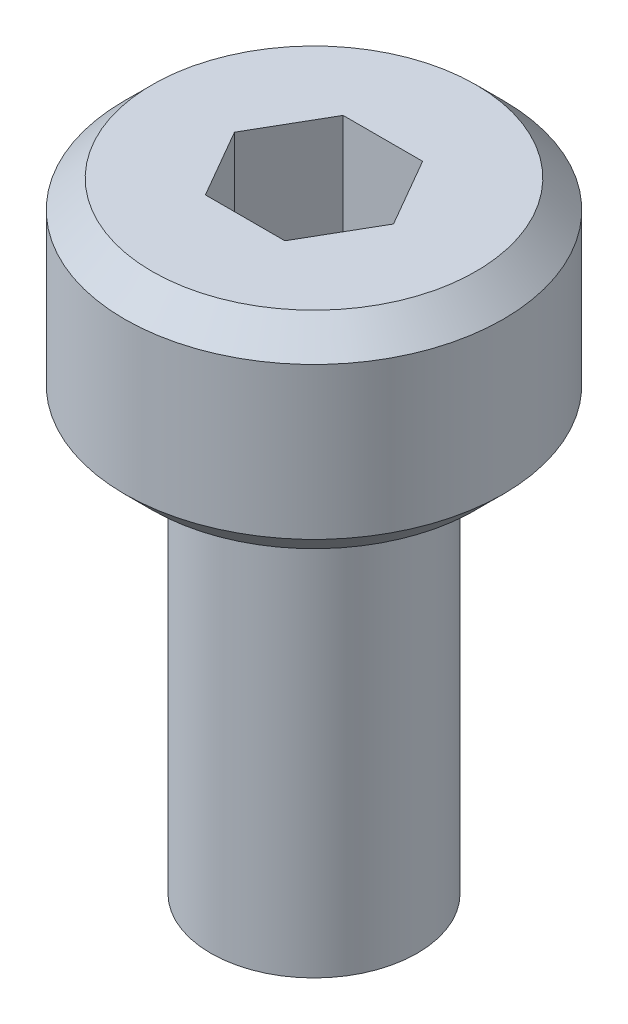
ISO-10303-21;
HEADER;
FILE_DESCRIPTION(('STEP AP214'),'2;1');
FILE_NAME('part.step','',(''),(''),'','','');
FILE_SCHEMA(('AUTOMOTIVE_DESIGN { 1 0 10303 214 1 1 1 1 }'));
ENDSEC;
DATA;
#1=APPLICATION_CONTEXT('core data for automotive mechanical design processes');
#2=APPLICATION_PROTOCOL_DEFINITION('international standard','automotive_design',2000,#1);
#3=PRODUCT_CONTEXT('',#1,'mechanical');
#4=PRODUCT('Part','Part','',(#3));
#5=PRODUCT_RELATED_PRODUCT_CATEGORY('part','',(#4));
#6=PRODUCT_DEFINITION_FORMATION('','',#4);
#7=PRODUCT_DEFINITION_CONTEXT('part definition',#1,'design');
#8=PRODUCT_DEFINITION('design','',#6,#7);
#9=PRODUCT_DEFINITION_SHAPE('','',#8);
#10=(LENGTH_UNIT() NAMED_UNIT(*) SI_UNIT(.MILLI.,.METRE.));
#11=(NAMED_UNIT(*) PLANE_ANGLE_UNIT() SI_UNIT($,.RADIAN.));
#12=(NAMED_UNIT(*) SI_UNIT($,.STERADIAN.) SOLID_ANGLE_UNIT());
#13=UNCERTAINTY_MEASURE_WITH_UNIT(LENGTH_MEASURE(1.E-05),#10,'distance_accuracy_value','');
#14=(GEOMETRIC_REPRESENTATION_CONTEXT(3) GLOBAL_UNCERTAINTY_ASSIGNED_CONTEXT((#13)) GLOBAL_UNIT_ASSIGNED_CONTEXT((#10,
#11,#12)) REPRESENTATION_CONTEXT('',''));
#15=CARTESIAN_POINT('',(0.,0.,0.));
#16=DIRECTION('',(0.,0.,1.));
#17=DIRECTION('',(1.,0.,0.));
#18=AXIS2_PLACEMENT_3D('',#15,#16,#17);
#19=CARTESIAN_POINT('',(0.,9.,0.));
#20=DIRECTION('',(0.,1.,0.));
#21=DIRECTION('',(0.,0.,1.));
#22=AXIS2_PLACEMENT_3D('',#19,#20,#21);
#23=PLANE('',#22);
#24=DIRECTION('',(1.,0.,0.));
#25=VECTOR('',#24,1.);
#26=CARTESIAN_POINT('',(-0.577350269189628,9.,1.));
#27=LINE('',#26,#25);
#28=CARTESIAN_POINT('',(-0.577350269189628,9.,1.));
#29=VERTEX_POINT('',#28);
#30=CARTESIAN_POINT('',(0.577350269189625,9.,1.));
#31=VERTEX_POINT('',#30);
#32=EDGE_CURVE('E58',#29,#31,#27,.T.);
#33=ORIENTED_EDGE('',*,*,#32,.F.);
#34=DIRECTION('',(0.499999999999999,0.,0.866025403784439));
#35=VECTOR('',#34,1.);
#36=CARTESIAN_POINT('',(-1.15470053837925,9.,0.));
#37=LINE('',#36,#35);
#38=CARTESIAN_POINT('',(-1.15470053837925,9.,0.));
#39=VERTEX_POINT('',#38);
#40=EDGE_CURVE('E151',#39,#29,#37,.T.);
#41=ORIENTED_EDGE('',*,*,#40,.F.);
#42=DIRECTION('',(-0.5,0.,0.866025403784439));
#43=VECTOR('',#42,1.);
#44=CARTESIAN_POINT('',(-0.577350269189626,9.,-1.));
#45=LINE('',#44,#43);
#46=CARTESIAN_POINT('',(-0.577350269189626,9.,-1.));
#47=VERTEX_POINT('',#46);
#48=EDGE_CURVE('E148',#47,#39,#45,.T.);
#49=ORIENTED_EDGE('',*,*,#48,.F.);
#50=DIRECTION('',(-1.,0.,0.));
#51=VECTOR('',#50,1.);
#52=CARTESIAN_POINT('',(0.577350269189625,9.,-1.));
#53=LINE('',#52,#51);
#54=CARTESIAN_POINT('',(0.577350269189625,9.,-1.));
#55=VERTEX_POINT('',#54);
#56=EDGE_CURVE('E106',#55,#47,#53,.T.);
#57=ORIENTED_EDGE('',*,*,#56,.F.);
#58=DIRECTION('',(-0.5,0.,-0.866025403784439));
#59=VECTOR('',#58,1.);
#60=CARTESIAN_POINT('',(1.15470053837925,9.,0.));
#61=LINE('',#60,#59);
#62=CARTESIAN_POINT('',(1.15470053837925,9.,0.));
#63=VERTEX_POINT('',#62);
#64=EDGE_CURVE('E142',#63,#55,#61,.T.);
#65=ORIENTED_EDGE('',*,*,#64,.F.);
#66=DIRECTION('',(0.5,0.,-0.866025403784439));
#67=VECTOR('',#66,1.);
#68=CARTESIAN_POINT('',(0.577350269189625,9.,1.));
#69=LINE('',#68,#67);
#70=EDGE_CURVE('E138',#31,#63,#69,.T.);
#71=ORIENTED_EDGE('',*,*,#70,.F.);
#72=EDGE_LOOP('',(#33,#41,#49,#57,#65,#71));
#73=FACE_BOUND('',#72,.T.);
#74=CARTESIAN_POINT('',(0.,9.,0.));
#75=DIRECTION('',(0.,1.,0.));
#76=DIRECTION('',(0.,0.,1.));
#77=AXIS2_PLACEMENT_3D('',#74,#75,#76);
#78=CIRCLE('',#77,2.35);
#79=CARTESIAN_POINT('',(0.,9.,-2.35));
#80=VERTEX_POINT('',#79);
#81=EDGE_CURVE('E11',#80,#80,#78,.T.);
#82=ORIENTED_EDGE('',*,*,#81,.T.);
#83=EDGE_LOOP('',(#82));
#84=FACE_BOUND('',#83,.T.);
#85=ADVANCED_FACE('F41',(#73,#84),#23,.T.);
#86=CARTESIAN_POINT('',(0.,0.,0.));
#87=DIRECTION('',(0.,-1.,0.));
#88=DIRECTION('',(0.,0.,-1.));
#89=AXIS2_PLACEMENT_3D('',#86,#87,#88);
#90=CYLINDRICAL_SURFACE('',#89,2.75);
#91=CARTESIAN_POINT('',(0.,6.4,0.));
#92=DIRECTION('',(0.,-1.,0.));
#93=DIRECTION('',(0.,0.,-1.));
#94=AXIS2_PLACEMENT_3D('',#91,#92,#93);
#95=CIRCLE('',#94,2.75);
#96=CARTESIAN_POINT('',(0.,6.4,-2.75));
#97=VERTEX_POINT('',#96);
#98=EDGE_CURVE('E51',#97,#97,#95,.F.);
#99=ORIENTED_EDGE('',*,*,#98,.T.);
#100=EDGE_LOOP('',(#99));
#101=FACE_BOUND('',#100,.T.);
#102=CARTESIAN_POINT('',(0.,8.6,0.));
#103=DIRECTION('',(0.,1.,0.));
#104=DIRECTION('',(0.,0.,1.));
#105=AXIS2_PLACEMENT_3D('',#102,#103,#104);
#106=CIRCLE('',#105,2.75);
#107=CARTESIAN_POINT('',(0.,8.6,-2.75));
#108=VERTEX_POINT('',#107);
#109=EDGE_CURVE('E178',#108,#108,#106,.F.);
#110=ORIENTED_EDGE('',*,*,#109,.T.);
#111=EDGE_LOOP('',(#110));
#112=FACE_BOUND('',#111,.T.);
#113=ADVANCED_FACE('F185',(#101,#112),#90,.T.);
#114=CARTESIAN_POINT('',(2.75,6.,0.));
#115=DIRECTION('',(0.,-1.,0.));
#116=DIRECTION('',(0.,0.,-1.));
#117=AXIS2_PLACEMENT_3D('',#114,#115,#116);
#118=PLANE('',#117);
#119=CARTESIAN_POINT('',(0.,6.,0.));
#120=DIRECTION('',(0.,-1.,0.));
#121=DIRECTION('',(0.,0.,-1.));
#122=AXIS2_PLACEMENT_3D('',#119,#120,#121);
#123=CIRCLE('',#122,2.35);
#124=CARTESIAN_POINT('',(0.,6.,-2.35));
#125=VERTEX_POINT('',#124);
#126=EDGE_CURVE('E174',#125,#125,#123,.T.);
#127=ORIENTED_EDGE('',*,*,#126,.T.);
#128=EDGE_LOOP('',(#127));
#129=FACE_BOUND('',#128,.T.);
#130=CARTESIAN_POINT('',(0.,6.,0.));
#131=DIRECTION('',(0.,-1.,0.));
#132=DIRECTION('',(0.,0.,-1.));
#133=AXIS2_PLACEMENT_3D('',#130,#131,#132);
#134=CIRCLE('',#133,1.5);
#135=CARTESIAN_POINT('',(0.,6.,-1.5));
#136=VERTEX_POINT('',#135);
#137=EDGE_CURVE('E170',#136,#136,#134,.T.);
#138=ORIENTED_EDGE('',*,*,#137,.F.);
#139=EDGE_LOOP('',(#138));
#140=FACE_BOUND('',#139,.T.);
#141=ADVANCED_FACE('F194',(#129,#140),#118,.T.);
#142=CARTESIAN_POINT('',(0.,0.,0.));
#143=DIRECTION('',(0.,-1.,0.));
#144=DIRECTION('',(0.,0.,-1.));
#145=AXIS2_PLACEMENT_3D('',#142,#143,#144);
#146=CYLINDRICAL_SURFACE('',#145,1.5);
#147=ORIENTED_EDGE('',*,*,#137,.T.);
#148=EDGE_LOOP('',(#147));
#149=FACE_BOUND('',#148,.T.);
#150=CARTESIAN_POINT('',(0.,0.,0.));
#151=DIRECTION('',(0.,-1.,0.));
#152=DIRECTION('',(0.,0.,-1.));
#153=AXIS2_PLACEMENT_3D('',#150,#151,#152);
#154=CIRCLE('',#153,1.5);
#155=CARTESIAN_POINT('',(0.,0.,-1.5));
#156=VERTEX_POINT('',#155);
#157=EDGE_CURVE('E157',#156,#156,#154,.T.);
#158=ORIENTED_EDGE('',*,*,#157,.F.);
#159=EDGE_LOOP('',(#158));
#160=FACE_BOUND('',#159,.T.);
#161=ADVANCED_FACE('F197',(#149,#160),#146,.T.);
#162=CARTESIAN_POINT('',(1.5,0.,0.));
#163=DIRECTION('',(0.,-1.,0.));
#164=DIRECTION('',(0.,0.,-1.));
#165=AXIS2_PLACEMENT_3D('',#162,#163,#164);
#166=PLANE('',#165);
#167=ORIENTED_EDGE('',*,*,#157,.T.);
#168=EDGE_LOOP('',(#167));
#169=FACE_BOUND('',#168,.T.);
#170=ADVANCED_FACE('F191',(#169),#166,.T.);
#171=CARTESIAN_POINT('',(0.,6.,0.));
#172=DIRECTION('',(0.,1.,0.));
#173=DIRECTION('',(0.,0.,1.));
#174=AXIS2_PLACEMENT_3D('',#171,#172,#173);
#175=CONICAL_SURFACE('',#174,2.35,0.785398163397446);
#176=ORIENTED_EDGE('',*,*,#98,.F.);
#177=EDGE_LOOP('',(#176));
#178=FACE_BOUND('',#177,.T.);
#179=ORIENTED_EDGE('',*,*,#126,.F.);
#180=EDGE_LOOP('',(#179));
#181=FACE_BOUND('',#180,.T.);
#182=ADVANCED_FACE('F188',(#178,#181),#175,.T.);
#183=CARTESIAN_POINT('',(0.,8.6,0.));
#184=DIRECTION('',(0.,-1.,0.));
#185=DIRECTION('',(0.,0.,-1.));
#186=AXIS2_PLACEMENT_3D('',#183,#184,#185);
#187=CONICAL_SURFACE('',#186,2.75,0.785398163397451);
#188=CARTESIAN_POINT('',(0.,9.,-2.35));
#189=CARTESIAN_POINT('',(0.,8.99583333333333,-2.35416666666667));
#190=CARTESIAN_POINT('',(0.,8.99166666666667,-2.35833333333333));
#191=CARTESIAN_POINT('',(0.,8.98333333333333,-2.36666666666667));
#192=CARTESIAN_POINT('',(0.,8.97916666666666,-2.37083333333333));
#193=CARTESIAN_POINT('',(0.,8.97083333333333,-2.37916666666667));
#194=CARTESIAN_POINT('',(0.,8.96666666666667,-2.38333333333333));
#195=CARTESIAN_POINT('',(0.,8.95833333333333,-2.39166666666667));
#196=CARTESIAN_POINT('',(0.,8.95416666666666,-2.39583333333333));
#197=CARTESIAN_POINT('',(0.,8.94583333333333,-2.40416666666667));
#198=CARTESIAN_POINT('',(0.,8.94166666666666,-2.40833333333333));
#199=CARTESIAN_POINT('',(0.,8.93333333333333,-2.41666666666667));
#200=CARTESIAN_POINT('',(0.,8.92916666666667,-2.42083333333333));
#201=CARTESIAN_POINT('',(0.,8.92083333333333,-2.42916666666667));
#202=CARTESIAN_POINT('',(0.,8.91666666666666,-2.43333333333333));
#203=CARTESIAN_POINT('',(0.,8.90833333333333,-2.44166666666667));
#204=CARTESIAN_POINT('',(0.,8.90416666666667,-2.44583333333333));
#205=CARTESIAN_POINT('',(0.,8.89583333333333,-2.45416666666667));
#206=CARTESIAN_POINT('',(0.,8.89166666666666,-2.45833333333333));
#207=CARTESIAN_POINT('',(0.,8.88333333333333,-2.46666666666667));
#208=CARTESIAN_POINT('',(0.,8.87916666666666,-2.47083333333333));
#209=CARTESIAN_POINT('',(0.,8.87083333333333,-2.47916666666667));
#210=CARTESIAN_POINT('',(0.,8.86666666666667,-2.48333333333333));
#211=CARTESIAN_POINT('',(0.,8.85833333333333,-2.49166666666667));
#212=CARTESIAN_POINT('',(0.,8.85416666666666,-2.49583333333333));
#213=CARTESIAN_POINT('',(0.,8.84583333333333,-2.50416666666667));
#214=CARTESIAN_POINT('',(0.,8.84166666666667,-2.50833333333333));
#215=CARTESIAN_POINT('',(0.,8.83333333333333,-2.51666666666667));
#216=CARTESIAN_POINT('',(0.,8.82916666666667,-2.52083333333333));
#217=CARTESIAN_POINT('',(0.,8.82083333333333,-2.52916666666667));
#218=CARTESIAN_POINT('',(0.,8.81666666666666,-2.53333333333333));
#219=CARTESIAN_POINT('',(0.,8.80833333333333,-2.54166666666667));
#220=CARTESIAN_POINT('',(0.,8.80416666666667,-2.54583333333333));
#221=CARTESIAN_POINT('',(0.,8.79583333333333,-2.55416666666667));
#222=CARTESIAN_POINT('',(0.,8.79166666666666,-2.55833333333333));
#223=CARTESIAN_POINT('',(0.,8.78333333333333,-2.56666666666667));
#224=CARTESIAN_POINT('',(0.,8.77916666666667,-2.57083333333333));
#225=CARTESIAN_POINT('',(0.,8.77083333333333,-2.57916666666667));
#226=CARTESIAN_POINT('',(0.,8.76666666666667,-2.58333333333333));
#227=CARTESIAN_POINT('',(0.,8.75833333333333,-2.59166666666667));
#228=CARTESIAN_POINT('',(0.,8.75416666666666,-2.59583333333333));
#229=CARTESIAN_POINT('',(0.,8.74583333333333,-2.60416666666667));
#230=CARTESIAN_POINT('',(0.,8.74166666666667,-2.60833333333333));
#231=CARTESIAN_POINT('',(0.,8.73333333333333,-2.61666666666667));
#232=CARTESIAN_POINT('',(0.,8.72916666666666,-2.62083333333333));
#233=CARTESIAN_POINT('',(0.,8.72083333333333,-2.62916666666667));
#234=CARTESIAN_POINT('',(0.,8.71666666666667,-2.63333333333333));
#235=CARTESIAN_POINT('',(0.,8.70833333333333,-2.64166666666667));
#236=CARTESIAN_POINT('',(0.,8.70416666666667,-2.64583333333333));
#237=CARTESIAN_POINT('',(0.,8.69583333333333,-2.65416666666667));
#238=CARTESIAN_POINT('',(0.,8.69166666666666,-2.65833333333333));
#239=CARTESIAN_POINT('',(0.,8.68333333333333,-2.66666666666667));
#240=CARTESIAN_POINT('',(0.,8.67916666666667,-2.67083333333333));
#241=CARTESIAN_POINT('',(0.,8.67083333333333,-2.67916666666667));
#242=CARTESIAN_POINT('',(0.,8.66666666666666,-2.68333333333333));
#243=CARTESIAN_POINT('',(0.,8.65833333333333,-2.69166666666667));
#244=CARTESIAN_POINT('',(0.,8.65416666666667,-2.69583333333333));
#245=CARTESIAN_POINT('',(0.,8.64583333333333,-2.70416666666667));
#246=CARTESIAN_POINT('',(0.,8.64166666666667,-2.70833333333333));
#247=CARTESIAN_POINT('',(0.,8.63333333333333,-2.71666666666667));
#248=CARTESIAN_POINT('',(0.,8.62916666666666,-2.72083333333333));
#249=CARTESIAN_POINT('',(0.,8.62083333333333,-2.72916666666667));
#250=CARTESIAN_POINT('',(0.,8.61666666666667,-2.73333333333333));
#251=CARTESIAN_POINT('',(0.,8.60833333333333,-2.74166666666667));
#252=CARTESIAN_POINT('',(0.,8.60416666666667,-2.74583333333333));
#253=CARTESIAN_POINT('',(0.,8.6,-2.75));
#254=B_SPLINE_CURVE_WITH_KNOTS('',3,(#188,#189,#190,#191,#192,#193,#194,#195,#196,#197,#198,
#199,#200,#201,#202,#203,#204,#205,#206,#207,#208,#209,#210,#211,#212,#213,#214,#215,#216,#217,
#218,#219,#220,#221,#222,#223,#224,#225,#226,#227,#228,#229,#230,#231,#232,#233,#234,#235,#236,
#237,#238,#239,#240,#241,#242,#243,#244,#245,#246,#247,#248,#249,#250,#251,#252,#253),
.UNSPECIFIED.,.F.,.F.,(4,2,2,2,2,2,2,2,2,2,2,2,2,2,2,2,2,2,2,2,2,2,2,2,2,2,2,2,2,2,2,2,4),(0.,
0.0176776695296639,0.0353553390593278,0.053033008588992,0.0707106781186558,0.0883883476483185,
0.106066017177983,0.123743686707647,0.14142135623731,0.159099025766975,0.176776695296637,
0.194454364826301,0.212132034355965,0.229809703885629,0.247487373415292,0.265165042944956,
0.28284271247462,0.300520382004284,0.318198051533948,0.335875721063611,0.353553390593275,
0.371231060122939,0.388908729652603,0.406586399182265,0.42426406871193,0.441941738241593,
0.459619407771257,0.477297077300921,0.494974746830584,0.512652416360248,0.530330085889912,
0.548007755419576,0.565685424949239),.UNSPECIFIED.);
#255=EDGE_CURVE('BSEAM44',#80,#108,#254,.T.);
#256=ORIENTED_EDGE('',*,*,#81,.F.);
#257=ORIENTED_EDGE('',*,*,#109,.F.);
#258=ORIENTED_EDGE('',*,*,#255,.T.);
#259=ORIENTED_EDGE('',*,*,#255,.F.);
#260=EDGE_LOOP('',(#256,#258,#257,#259));
#261=FACE_BOUND('',#260,.T.);
#262=ADVANCED_FACE('F44',(#261),#187,.T.);
#263=CARTESIAN_POINT('',(-0.577350269189628,5.,1.));
#264=DIRECTION('',(0.,0.,1.));
#265=DIRECTION('',(1.,0.,0.));
#266=AXIS2_PLACEMENT_3D('',#263,#264,#265);
#267=PLANE('',#266);
#268=ORIENTED_EDGE('',*,*,#32,.T.);
#269=DIRECTION('',(0.,1.,0.));
#270=VECTOR('',#269,1.);
#271=CARTESIAN_POINT('',(0.577350269189625,5.,1.));
#272=LINE('',#271,#270);
#273=CARTESIAN_POINT('',(0.577350269189625,5.,1.));
#274=VERTEX_POINT('',#273);
#275=EDGE_CURVE('E88',#274,#31,#272,.T.);
#276=ORIENTED_EDGE('',*,*,#275,.F.);
#277=DIRECTION('',(1.,0.,0.));
#278=VECTOR('',#277,1.);
#279=CARTESIAN_POINT('',(-0.577350269189628,5.,1.));
#280=LINE('',#279,#278);
#281=CARTESIAN_POINT('',(-0.577350269189628,5.,1.));
#282=VERTEX_POINT('',#281);
#283=EDGE_CURVE('E154',#282,#274,#280,.T.);
#284=ORIENTED_EDGE('',*,*,#283,.F.);
#285=DIRECTION('',(0.,1.,0.));
#286=VECTOR('',#285,1.);
#287=CARTESIAN_POINT('',(-0.577350269189628,5.,1.));
#288=LINE('',#287,#286);
#289=EDGE_CURVE('E66',#282,#29,#288,.T.);
#290=ORIENTED_EDGE('',*,*,#289,.T.);
#291=EDGE_LOOP('',(#268,#276,#284,#290));
#292=FACE_BOUND('',#291,.T.);
#293=ADVANCED_FACE('F230',(#292),#267,.F.);
#294=CARTESIAN_POINT('',(-1.15470053837925,5.,0.));
#295=DIRECTION('',(-0.866025403784439,0.,0.499999999999999));
#296=DIRECTION('',(0.499999999999999,0.,0.866025403784439));
#297=AXIS2_PLACEMENT_3D('',#294,#295,#296);
#298=PLANE('',#297);
#299=ORIENTED_EDGE('',*,*,#40,.T.);
#300=ORIENTED_EDGE('',*,*,#289,.F.);
#301=DIRECTION('',(0.499999999999999,0.,0.866025403784439));
#302=VECTOR('',#301,1.);
#303=CARTESIAN_POINT('',(-1.15470053837925,5.,0.));
#304=LINE('',#303,#302);
#305=CARTESIAN_POINT('',(-1.15470053837925,5.,0.));
#306=VERTEX_POINT('',#305);
#307=EDGE_CURVE('E120',#306,#282,#304,.T.);
#308=ORIENTED_EDGE('',*,*,#307,.F.);
#309=DIRECTION('',(0.,1.,0.));
#310=VECTOR('',#309,1.);
#311=CARTESIAN_POINT('',(-1.15470053837925,5.,0.));
#312=LINE('',#311,#310);
#313=EDGE_CURVE('E111',#306,#39,#312,.T.);
#314=ORIENTED_EDGE('',*,*,#313,.T.);
#315=EDGE_LOOP('',(#299,#300,#308,#314));
#316=FACE_BOUND('',#315,.T.);
#317=ADVANCED_FACE('F235',(#316),#298,.F.);
#318=CARTESIAN_POINT('',(-0.577350269189626,5.,-1.));
#319=DIRECTION('',(-0.866025403784439,0.,-0.5));
#320=DIRECTION('',(-0.5,0.,0.866025403784439));
#321=AXIS2_PLACEMENT_3D('',#318,#319,#320);
#322=PLANE('',#321);
#323=ORIENTED_EDGE('',*,*,#48,.T.);
#324=ORIENTED_EDGE('',*,*,#313,.F.);
#325=DIRECTION('',(-0.5,0.,0.866025403784439));
#326=VECTOR('',#325,1.);
#327=CARTESIAN_POINT('',(-0.577350269189626,5.,-1.));
#328=LINE('',#327,#326);
#329=CARTESIAN_POINT('',(-0.577350269189626,5.,-1.));
#330=VERTEX_POINT('',#329);
#331=EDGE_CURVE('E115',#330,#306,#328,.T.);
#332=ORIENTED_EDGE('',*,*,#331,.F.);
#333=DIRECTION('',(0.,1.,0.));
#334=VECTOR('',#333,1.);
#335=CARTESIAN_POINT('',(-0.577350269189626,5.,-1.));
#336=LINE('',#335,#334);
#337=EDGE_CURVE('E99',#330,#47,#336,.T.);
#338=ORIENTED_EDGE('',*,*,#337,.T.);
#339=EDGE_LOOP('',(#323,#324,#332,#338));
#340=FACE_BOUND('',#339,.T.);
#341=ADVANCED_FACE('F116',(#340),#322,.F.);
#342=CARTESIAN_POINT('',(0.577350269189625,5.,-1.));
#343=DIRECTION('',(0.,0.,-1.));
#344=DIRECTION('',(-1.,0.,0.));
#345=AXIS2_PLACEMENT_3D('',#342,#343,#344);
#346=PLANE('',#345);
#347=ORIENTED_EDGE('',*,*,#56,.T.);
#348=ORIENTED_EDGE('',*,*,#337,.F.);
#349=DIRECTION('',(-1.,0.,0.));
#350=VECTOR('',#349,1.);
#351=CARTESIAN_POINT('',(0.577350269189625,5.,-1.));
#352=LINE('',#351,#350);
#353=CARTESIAN_POINT('',(0.577350269189625,5.,-1.));
#354=VERTEX_POINT('',#353);
#355=EDGE_CURVE('E103',#354,#330,#352,.T.);
#356=ORIENTED_EDGE('',*,*,#355,.F.);
#357=DIRECTION('',(0.,1.,0.));
#358=VECTOR('',#357,1.);
#359=CARTESIAN_POINT('',(0.577350269189625,5.,-1.));
#360=LINE('',#359,#358);
#361=EDGE_CURVE('E112',#354,#55,#360,.T.);
#362=ORIENTED_EDGE('',*,*,#361,.T.);
#363=EDGE_LOOP('',(#347,#348,#356,#362));
#364=FACE_BOUND('',#363,.T.);
#365=ADVANCED_FACE('F101',(#364),#346,.F.);
#366=CARTESIAN_POINT('',(1.15470053837925,5.,0.));
#367=DIRECTION('',(0.866025403784439,0.,-0.5));
#368=DIRECTION('',(-0.5,0.,-0.866025403784439));
#369=AXIS2_PLACEMENT_3D('',#366,#367,#368);
#370=PLANE('',#369);
#371=ORIENTED_EDGE('',*,*,#64,.T.);
#372=ORIENTED_EDGE('',*,*,#361,.F.);
#373=DIRECTION('',(-0.5,0.,-0.866025403784439));
#374=VECTOR('',#373,1.);
#375=CARTESIAN_POINT('',(1.15470053837925,5.,0.));
#376=LINE('',#375,#374);
#377=CARTESIAN_POINT('',(1.15470053837925,5.,0.));
#378=VERTEX_POINT('',#377);
#379=EDGE_CURVE('E126',#378,#354,#376,.T.);
#380=ORIENTED_EDGE('',*,*,#379,.F.);
#381=DIRECTION('',(0.,1.,0.));
#382=VECTOR('',#381,1.);
#383=CARTESIAN_POINT('',(1.15470053837925,5.,0.));
#384=LINE('',#383,#382);
#385=EDGE_CURVE('E162',#378,#63,#384,.T.);
#386=ORIENTED_EDGE('',*,*,#385,.T.);
#387=EDGE_LOOP('',(#371,#372,#380,#386));
#388=FACE_BOUND('',#387,.T.);
#389=ADVANCED_FACE('F244',(#388),#370,.F.);
#390=CARTESIAN_POINT('',(0.577350269189625,5.,1.));
#391=DIRECTION('',(0.866025403784439,0.,0.5));
#392=DIRECTION('',(0.5,0.,-0.866025403784439));
#393=AXIS2_PLACEMENT_3D('',#390,#391,#392);
#394=PLANE('',#393);
#395=ORIENTED_EDGE('',*,*,#70,.T.);
#396=ORIENTED_EDGE('',*,*,#385,.F.);
#397=DIRECTION('',(0.5,0.,-0.866025403784439));
#398=VECTOR('',#397,1.);
#399=CARTESIAN_POINT('',(0.577350269189625,5.,1.));
#400=LINE('',#399,#398);
#401=EDGE_CURVE('E130',#274,#378,#400,.T.);
#402=ORIENTED_EDGE('',*,*,#401,.F.);
#403=ORIENTED_EDGE('',*,*,#275,.T.);
#404=EDGE_LOOP('',(#395,#396,#402,#403));
#405=FACE_BOUND('',#404,.T.);
#406=ADVANCED_FACE('F241',(#405),#394,.F.);
#407=CARTESIAN_POINT('',(0.,5.,0.));
#408=DIRECTION('',(0.,1.,0.));
#409=DIRECTION('',(0.,0.,1.));
#410=AXIS2_PLACEMENT_3D('',#407,#408,#409);
#411=PLANE('',#410);
#412=ORIENTED_EDGE('',*,*,#283,.T.);
#413=ORIENTED_EDGE('',*,*,#401,.T.);
#414=ORIENTED_EDGE('',*,*,#379,.T.);
#415=ORIENTED_EDGE('',*,*,#355,.T.);
#416=ORIENTED_EDGE('',*,*,#331,.T.);
#417=ORIENTED_EDGE('',*,*,#307,.T.);
#418=EDGE_LOOP('',(#412,#413,#414,#415,#416,#417));
#419=FACE_BOUND('',#418,.T.);
#420=ADVANCED_FACE('F123',(#419),#411,.T.);
#421=CLOSED_SHELL('',(#85,#113,#141,#161,#170,#182,#262,#293,#317,#341,#365,#389,#406,#420));
#422=MANIFOLD_SOLID_BREP('B2',#421);
#423=ADVANCED_BREP_SHAPE_REPRESENTATION('',(#18,#422),#14);
#424=SHAPE_DEFINITION_REPRESENTATION(#9,#423);
ENDSEC;
END-ISO-10303-21;
